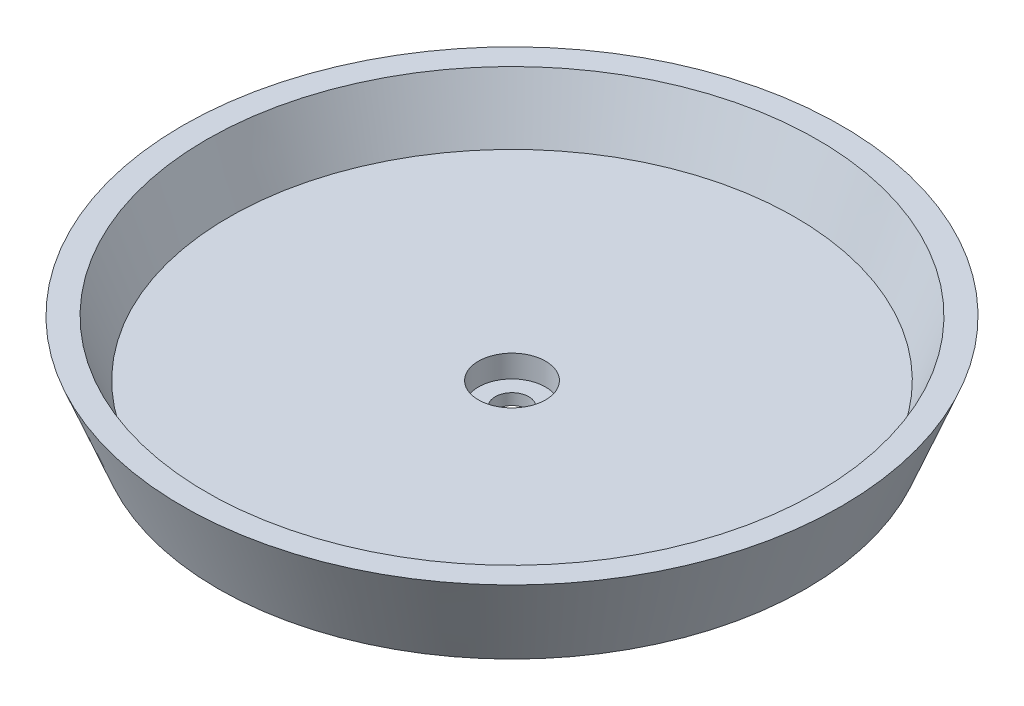
ISO-10303-21;
HEADER;
FILE_DESCRIPTION(('STEP AP214'),'2;1');
FILE_NAME('part.step','',(''),(''),'','','');
FILE_SCHEMA(('AUTOMOTIVE_DESIGN { 1 0 10303 214 1 1 1 1 }'));
ENDSEC;
DATA;
#1=APPLICATION_CONTEXT('core data for automotive mechanical design processes');
#2=APPLICATION_PROTOCOL_DEFINITION('international standard','automotive_design',2000,#1);
#3=PRODUCT_CONTEXT('',#1,'mechanical');
#4=PRODUCT('Part','Part','',(#3));
#5=PRODUCT_RELATED_PRODUCT_CATEGORY('part','',(#4));
#6=PRODUCT_DEFINITION_FORMATION('','',#4);
#7=PRODUCT_DEFINITION_CONTEXT('part definition',#1,'design');
#8=PRODUCT_DEFINITION('design','',#6,#7);
#9=PRODUCT_DEFINITION_SHAPE('','',#8);
#10=(LENGTH_UNIT() NAMED_UNIT(*) SI_UNIT(.MILLI.,.METRE.));
#11=(NAMED_UNIT(*) PLANE_ANGLE_UNIT() SI_UNIT($,.RADIAN.));
#12=(NAMED_UNIT(*) SI_UNIT($,.STERADIAN.) SOLID_ANGLE_UNIT());
#13=UNCERTAINTY_MEASURE_WITH_UNIT(LENGTH_MEASURE(1.E-05),#10,'distance_accuracy_value','');
#14=(GEOMETRIC_REPRESENTATION_CONTEXT(3) GLOBAL_UNCERTAINTY_ASSIGNED_CONTEXT((#13)) GLOBAL_UNIT_ASSIGNED_CONTEXT((#10,
#11,#12)) REPRESENTATION_CONTEXT('',''));
#15=CARTESIAN_POINT('',(0.,0.,0.));
#16=DIRECTION('',(0.,0.,1.));
#17=DIRECTION('',(1.,0.,0.));
#18=AXIS2_PLACEMENT_3D('',#15,#16,#17);
#19=CARTESIAN_POINT('',(-16.5773971627522,13.4761695896848,0.));
#20=DIRECTION('',(0.,1.,0.));
#21=DIRECTION('',(-1.,0.,0.));
#22=AXIS2_PLACEMENT_3D('',#19,#20,#21);
#23=CONICAL_SURFACE('',#22,29.4540659228538,0.380506377112365);
#24=CARTESIAN_POINT('',(-16.5773971627522,5.47616958968478,0.));
#25=DIRECTION('',(0.,-1.,0.));
#26=DIRECTION('',(1.,0.,0.));
#27=AXIS2_PLACEMENT_3D('',#24,#25,#26);
#28=CIRCLE('',#27,26.2540659228538);
#29=CARTESIAN_POINT('',(9.6766687601016,5.47616958968477,0.));
#30=VERTEX_POINT('',#29);
#31=EDGE_CURVE('E10',#30,#30,#28,.T.);
#32=ORIENTED_EDGE('',*,*,#31,.F.);
#33=EDGE_LOOP('',(#32));
#34=FACE_BOUND('',#33,.T.);
#35=CARTESIAN_POINT('',(-16.5773971627522,13.4761695896848,0.));
#36=DIRECTION('',(0.,-1.,0.));
#37=DIRECTION('',(1.,0.,0.));
#38=AXIS2_PLACEMENT_3D('',#35,#36,#37);
#39=CIRCLE('',#38,29.4540659228538);
#40=CARTESIAN_POINT('',(12.8766687601016,13.4761695896848,0.));
#41=VERTEX_POINT('',#40);
#42=EDGE_CURVE('E76',#41,#41,#39,.T.);
#43=ORIENTED_EDGE('',*,*,#42,.T.);
#44=EDGE_LOOP('',(#43));
#45=FACE_BOUND('',#44,.T.);
#46=ADVANCED_FACE('F50',(#34,#45),#23,.T.);
#47=CARTESIAN_POINT('',(0.,5.47616958968478,0.));
#48=DIRECTION('',(0.,-1.,0.));
#49=DIRECTION('',(1.,0.,0.));
#50=AXIS2_PLACEMENT_3D('',#47,#48,#49);
#51=PLANE('',#50);
#52=ORIENTED_EDGE('',*,*,#31,.T.);
#53=EDGE_LOOP('',(#52));
#54=FACE_BOUND('',#53,.T.);
#55=CARTESIAN_POINT('',(-16.5773971627522,5.47616958968479,0.));
#56=DIRECTION('',(0.,-1.,0.));
#57=DIRECTION('',(1.,0.,0.));
#58=AXIS2_PLACEMENT_3D('',#55,#56,#57);
#59=CIRCLE('',#58,1.5);
#60=CARTESIAN_POINT('',(-15.0773971627522,5.47616958968479,0.));
#61=VERTEX_POINT('',#60);
#62=EDGE_CURVE('E53',#61,#61,#59,.T.);
#63=ORIENTED_EDGE('',*,*,#62,.F.);
#64=EDGE_LOOP('',(#63));
#65=FACE_BOUND('',#64,.T.);
#66=ADVANCED_FACE('F97',(#54,#65),#51,.T.);
#67=CARTESIAN_POINT('',(-16.5773971627522,5.4761695896848,0.));
#68=DIRECTION('',(0.,-1.,0.));
#69=DIRECTION('',(1.,0.,0.));
#70=AXIS2_PLACEMENT_3D('',#67,#68,#69);
#71=CYLINDRICAL_SURFACE('',#70,1.5);
#72=CARTESIAN_POINT('',(-16.5773971627522,6.4761695896848,0.));
#73=DIRECTION('',(0.,-1.,0.));
#74=DIRECTION('',(1.,0.,0.));
#75=AXIS2_PLACEMENT_3D('',#72,#73,#74);
#76=CIRCLE('',#75,1.5);
#77=CARTESIAN_POINT('',(-15.0773971627522,6.47616958968479,0.));
#78=VERTEX_POINT('',#77);
#79=EDGE_CURVE('E59',#78,#78,#76,.T.);
#80=ORIENTED_EDGE('',*,*,#79,.F.);
#81=EDGE_LOOP('',(#80));
#82=FACE_BOUND('',#81,.T.);
#83=ORIENTED_EDGE('',*,*,#62,.T.);
#84=EDGE_LOOP('',(#83));
#85=FACE_BOUND('',#84,.T.);
#86=ADVANCED_FACE('F103',(#82,#85),#71,.F.);
#87=CARTESIAN_POINT('',(0.,6.47616958968479,0.));
#88=DIRECTION('',(0.,-1.,0.));
#89=DIRECTION('',(1.,0.,0.));
#90=AXIS2_PLACEMENT_3D('',#87,#88,#89);
#91=PLANE('',#90);
#92=CARTESIAN_POINT('',(-16.5773971627522,6.47616958968479,0.));
#93=DIRECTION('',(0.,-1.,0.));
#94=DIRECTION('',(1.,0.,0.));
#95=AXIS2_PLACEMENT_3D('',#92,#93,#94);
#96=CIRCLE('',#95,3.00000000000001);
#97=CARTESIAN_POINT('',(-13.5773971627522,6.47616958968479,0.));
#98=VERTEX_POINT('',#97);
#99=EDGE_CURVE('E62',#98,#98,#96,.T.);
#100=ORIENTED_EDGE('',*,*,#99,.F.);
#101=EDGE_LOOP('',(#100));
#102=FACE_BOUND('',#101,.T.);
#103=ORIENTED_EDGE('',*,*,#79,.T.);
#104=EDGE_LOOP('',(#103));
#105=FACE_BOUND('',#104,.T.);
#106=ADVANCED_FACE('F106',(#102,#105),#91,.F.);
#107=CARTESIAN_POINT('',(-16.5773971627522,5.4761695896848,0.));
#108=DIRECTION('',(0.,-1.,0.));
#109=DIRECTION('',(1.,0.,0.));
#110=AXIS2_PLACEMENT_3D('',#107,#108,#109);
#111=CYLINDRICAL_SURFACE('',#110,3.00000000000001);
#112=ORIENTED_EDGE('',*,*,#99,.T.);
#113=EDGE_LOOP('',(#112));
#114=FACE_BOUND('',#113,.T.);
#115=CARTESIAN_POINT('',(-16.5773971627522,8.47616958968479,0.));
#116=DIRECTION('',(0.,-1.,0.));
#117=DIRECTION('',(1.,0.,0.));
#118=AXIS2_PLACEMENT_3D('',#115,#116,#117);
#119=CIRCLE('',#118,3.00000000000001);
#120=CARTESIAN_POINT('',(-13.5773971627522,8.47616958968479,0.));
#121=VERTEX_POINT('',#120);
#122=EDGE_CURVE('E69',#121,#121,#119,.T.);
#123=ORIENTED_EDGE('',*,*,#122,.F.);
#124=EDGE_LOOP('',(#123));
#125=FACE_BOUND('',#124,.T.);
#126=ADVANCED_FACE('F94',(#114,#125),#111,.F.);
#127=CARTESIAN_POINT('',(0.,8.47616958968478,0.));
#128=DIRECTION('',(0.,1.,0.));
#129=DIRECTION('',(-1.,0.,0.));
#130=AXIS2_PLACEMENT_3D('',#127,#128,#129);
#131=PLANE('',#130);
#132=ORIENTED_EDGE('',*,*,#122,.T.);
#133=EDGE_LOOP('',(#132));
#134=FACE_BOUND('',#133,.T.);
#135=CARTESIAN_POINT('',(-16.5773971627522,8.47616958968478,0.));
#136=DIRECTION('',(0.,-1.,0.));
#137=DIRECTION('',(1.,0.,0.));
#138=AXIS2_PLACEMENT_3D('',#135,#136,#137);
#139=CIRCLE('',#138,25.3);
#140=CARTESIAN_POINT('',(8.72260283724779,8.47616958968477,0.));
#141=VERTEX_POINT('',#140);
#142=EDGE_CURVE('E68',#141,#141,#139,.T.);
#143=ORIENTED_EDGE('',*,*,#142,.F.);
#144=EDGE_LOOP('',(#143));
#145=FACE_BOUND('',#144,.T.);
#146=ADVANCED_FACE('F90',(#134,#145),#131,.T.);
#147=CARTESIAN_POINT('',(-16.5773971627522,13.4761695896848,0.));
#148=DIRECTION('',(0.,1.,0.));
#149=DIRECTION('',(-1.,0.,0.));
#150=AXIS2_PLACEMENT_3D('',#147,#148,#149);
#151=CONICAL_SURFACE('',#150,27.3,0.380506377112365);
#152=ORIENTED_EDGE('',*,*,#142,.T.);
#153=EDGE_LOOP('',(#152));
#154=FACE_BOUND('',#153,.T.);
#155=CARTESIAN_POINT('',(-16.5773971627522,13.4761695896848,0.));
#156=DIRECTION('',(0.,-1.,0.));
#157=DIRECTION('',(1.,0.,0.));
#158=AXIS2_PLACEMENT_3D('',#155,#156,#157);
#159=CIRCLE('',#158,27.3);
#160=CARTESIAN_POINT('',(10.7226028372478,13.4761695896848,0.));
#161=VERTEX_POINT('',#160);
#162=EDGE_CURVE('E71',#161,#161,#159,.T.);
#163=ORIENTED_EDGE('',*,*,#162,.F.);
#164=EDGE_LOOP('',(#163));
#165=FACE_BOUND('',#164,.T.);
#166=ADVANCED_FACE('F81',(#154,#165),#151,.F.);
#167=CARTESIAN_POINT('',(0.,13.4761695896848,0.));
#168=DIRECTION('',(0.,-1.,0.));
#169=DIRECTION('',(1.,0.,0.));
#170=AXIS2_PLACEMENT_3D('',#167,#168,#169);
#171=PLANE('',#170);
#172=ORIENTED_EDGE('',*,*,#42,.F.);
#173=EDGE_LOOP('',(#172));
#174=FACE_BOUND('',#173,.T.);
#175=ORIENTED_EDGE('',*,*,#162,.T.);
#176=EDGE_LOOP('',(#175));
#177=FACE_BOUND('',#176,.T.);
#178=ADVANCED_FACE('F82',(#174,#177),#171,.F.);
#179=CLOSED_SHELL('',(#46,#66,#86,#106,#126,#146,#166,#178));
#180=MANIFOLD_SOLID_BREP('B2',#179);
#181=ADVANCED_BREP_SHAPE_REPRESENTATION('',(#18,#180),#14);
#182=SHAPE_DEFINITION_REPRESENTATION(#9,#181);
ENDSEC;
END-ISO-10303-21;
